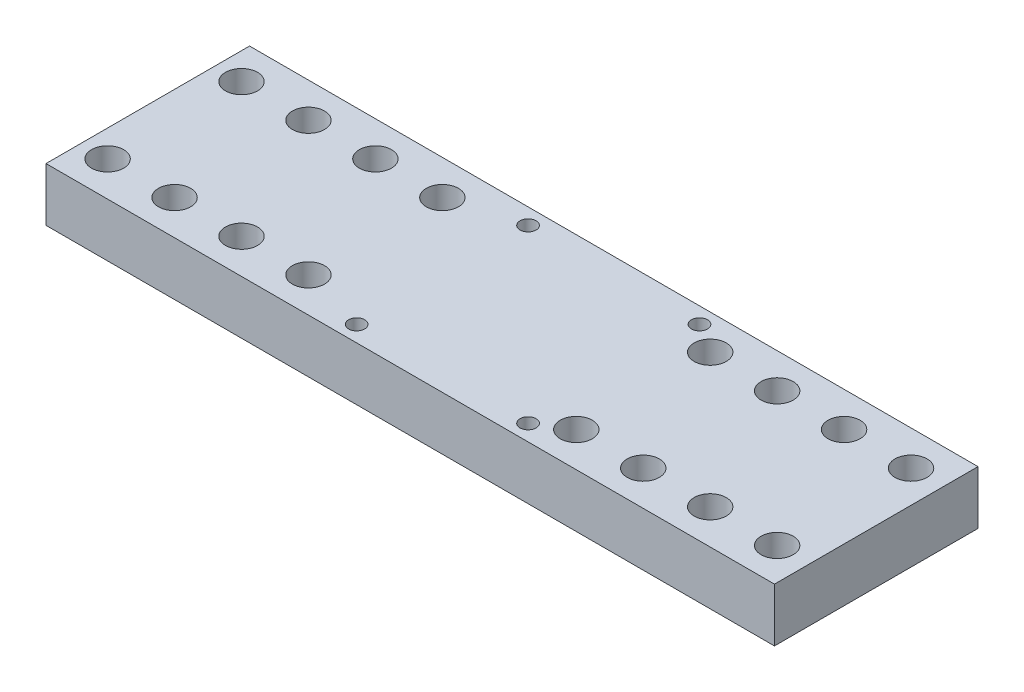
ISO-10303-21;
HEADER;
FILE_DESCRIPTION(('STEP AP214'),'2;1');
FILE_NAME('part.step','',(''),(''),'','','');
FILE_SCHEMA(('AUTOMOTIVE_DESIGN { 1 0 10303 214 1 1 1 1 }'));
ENDSEC;
DATA;
#1=APPLICATION_CONTEXT('core data for automotive mechanical design processes');
#2=APPLICATION_PROTOCOL_DEFINITION('international standard','automotive_design',2000,#1);
#3=PRODUCT_CONTEXT('',#1,'mechanical');
#4=PRODUCT('Part','Part','',(#3));
#5=PRODUCT_RELATED_PRODUCT_CATEGORY('part','',(#4));
#6=PRODUCT_DEFINITION_FORMATION('','',#4);
#7=PRODUCT_DEFINITION_CONTEXT('part definition',#1,'design');
#8=PRODUCT_DEFINITION('design','',#6,#7);
#9=PRODUCT_DEFINITION_SHAPE('','',#8);
#10=(LENGTH_UNIT() NAMED_UNIT(*) SI_UNIT(.MILLI.,.METRE.));
#11=(NAMED_UNIT(*) PLANE_ANGLE_UNIT() SI_UNIT($,.RADIAN.));
#12=(NAMED_UNIT(*) SI_UNIT($,.STERADIAN.) SOLID_ANGLE_UNIT());
#13=UNCERTAINTY_MEASURE_WITH_UNIT(LENGTH_MEASURE(1.E-05),#10,'distance_accuracy_value','');
#14=(GEOMETRIC_REPRESENTATION_CONTEXT(3) GLOBAL_UNCERTAINTY_ASSIGNED_CONTEXT((#13)) GLOBAL_UNIT_ASSIGNED_CONTEXT((#10,
#11,#12)) REPRESENTATION_CONTEXT('',''));
#15=CARTESIAN_POINT('',(0.,0.,0.));
#16=DIRECTION('',(0.,0.,1.));
#17=DIRECTION('',(1.,0.,0.));
#18=AXIS2_PLACEMENT_3D('',#15,#16,#17);
#19=CARTESIAN_POINT('',(0.,10.,0.));
#20=DIRECTION('',(0.,-1.,0.));
#21=DIRECTION('',(0.,0.,-1.));
#22=AXIS2_PLACEMENT_3D('',#19,#20,#21);
#23=PLANE('',#22);
#24=DIRECTION('',(0.,0.,1.));
#25=VECTOR('',#24,1.);
#26=CARTESIAN_POINT('',(-70.9695021838503,10.,35.35946325853));
#27=LINE('',#26,#25);
#28=CARTESIAN_POINT('',(-70.9695021838503,10.,-2.64053674146996));
#29=VERTEX_POINT('',#28);
#30=CARTESIAN_POINT('',(-70.9695021838503,10.,35.35946325853));
#31=VERTEX_POINT('',#30);
#32=EDGE_CURVE('E85',#29,#31,#27,.T.);
#33=ORIENTED_EDGE('',*,*,#32,.T.);
#34=DIRECTION('',(1.,0.,0.));
#35=VECTOR('',#34,1.);
#36=CARTESIAN_POINT('',(-70.9695021838503,10.,35.35946325853));
#37=LINE('',#36,#35);
#38=CARTESIAN_POINT('',(65.0304978161497,10.,35.35946325853));
#39=VERTEX_POINT('',#38);
#40=EDGE_CURVE('E80',#31,#39,#37,.T.);
#41=ORIENTED_EDGE('',*,*,#40,.T.);
#42=DIRECTION('',(0.,0.,-1.));
#43=VECTOR('',#42,1.);
#44=CARTESIAN_POINT('',(65.0304978161497,10.,35.35946325853));
#45=LINE('',#44,#43);
#46=CARTESIAN_POINT('',(65.0304978161497,10.,-2.64053674146996));
#47=VERTEX_POINT('',#46);
#48=EDGE_CURVE('E83',#39,#47,#45,.T.);
#49=ORIENTED_EDGE('',*,*,#48,.T.);
#50=DIRECTION('',(-1.,0.,0.));
#51=VECTOR('',#50,1.);
#52=CARTESIAN_POINT('',(-70.9695021838503,10.,-2.64053674146996));
#53=LINE('',#52,#51);
#54=EDGE_CURVE('E50',#47,#29,#53,.T.);
#55=ORIENTED_EDGE('',*,*,#54,.T.);
#56=EDGE_LOOP('',(#33,#41,#49,#55));
#57=FACE_BOUND('',#56,.T.);
#58=CARTESIAN_POINT('',(-15.9695021838503,10.,0.359463258530042));
#59=DIRECTION('',(0.,1.,0.));
#60=DIRECTION('',(0.,0.,1.));
#61=AXIS2_PLACEMENT_3D('',#58,#59,#60);
#62=CIRCLE('',#61,1.5);
#63=CARTESIAN_POINT('',(-15.9695021838503,10.,1.85946325853004));
#64=VERTEX_POINT('',#63);
#65=EDGE_CURVE('E100',#64,#64,#62,.T.);
#66=ORIENTED_EDGE('',*,*,#65,.F.);
#67=EDGE_LOOP('',(#66));
#68=FACE_BOUND('',#67,.T.);
#69=CARTESIAN_POINT('',(16.0304978161497,10.,0.359463258530042));
#70=DIRECTION('',(0.,1.,0.));
#71=DIRECTION('',(0.,0.,1.));
#72=AXIS2_PLACEMENT_3D('',#69,#70,#71);
#73=CIRCLE('',#72,1.5);
#74=CARTESIAN_POINT('',(16.0304978161497,10.,1.85946325853004));
#75=VERTEX_POINT('',#74);
#76=EDGE_CURVE('E115',#75,#75,#73,.T.);
#77=ORIENTED_EDGE('',*,*,#76,.F.);
#78=EDGE_LOOP('',(#77));
#79=FACE_BOUND('',#78,.T.);
#80=CARTESIAN_POINT('',(16.0304978161497,10.,32.35946325853));
#81=DIRECTION('',(0.,1.,0.));
#82=DIRECTION('',(0.,0.,1.));
#83=AXIS2_PLACEMENT_3D('',#80,#81,#82);
#84=CIRCLE('',#83,1.5);
#85=CARTESIAN_POINT('',(16.0304978161497,10.,33.85946325853));
#86=VERTEX_POINT('',#85);
#87=EDGE_CURVE('E121',#86,#86,#84,.T.);
#88=ORIENTED_EDGE('',*,*,#87,.F.);
#89=EDGE_LOOP('',(#88));
#90=FACE_BOUND('',#89,.T.);
#91=CARTESIAN_POINT('',(-15.9695021838503,10.,32.35946325853));
#92=DIRECTION('',(0.,1.,0.));
#93=DIRECTION('',(0.,0.,1.));
#94=AXIS2_PLACEMENT_3D('',#91,#92,#93);
#95=CIRCLE('',#94,1.5);
#96=CARTESIAN_POINT('',(-15.9695021838503,10.,33.85946325853));
#97=VERTEX_POINT('',#96);
#98=EDGE_CURVE('E127',#97,#97,#95,.T.);
#99=ORIENTED_EDGE('',*,*,#98,.F.);
#100=EDGE_LOOP('',(#99));
#101=FACE_BOUND('',#100,.T.);
#102=CARTESIAN_POINT('',(-65.9695021838503,10.,3.85946325853004));
#103=DIRECTION('',(0.,1.,0.));
#104=DIRECTION('',(0.,0.,1.));
#105=AXIS2_PLACEMENT_3D('',#102,#103,#104);
#106=CIRCLE('',#105,3.00000000000001);
#107=CARTESIAN_POINT('',(-65.9695021838503,10.,6.85946325853005));
#108=VERTEX_POINT('',#107);
#109=EDGE_CURVE('E133',#108,#108,#106,.T.);
#110=ORIENTED_EDGE('',*,*,#109,.F.);
#111=EDGE_LOOP('',(#110));
#112=FACE_BOUND('',#111,.T.);
#113=CARTESIAN_POINT('',(-40.9695021838503,10.,3.85946325853004));
#114=DIRECTION('',(0.,1.,0.));
#115=DIRECTION('',(0.,0.,1.));
#116=AXIS2_PLACEMENT_3D('',#113,#114,#115);
#117=CIRCLE('',#116,3.);
#118=CARTESIAN_POINT('',(-40.9695021838503,10.,6.85946325853004));
#119=VERTEX_POINT('',#118);
#120=EDGE_CURVE('E139',#119,#119,#117,.T.);
#121=ORIENTED_EDGE('',*,*,#120,.F.);
#122=EDGE_LOOP('',(#121));
#123=FACE_BOUND('',#122,.T.);
#124=CARTESIAN_POINT('',(-40.9695021838503,10.,28.85946325853));
#125=DIRECTION('',(0.,1.,0.));
#126=DIRECTION('',(0.,0.,1.));
#127=AXIS2_PLACEMENT_3D('',#124,#125,#126);
#128=CIRCLE('',#127,3.);
#129=CARTESIAN_POINT('',(-40.9695021838503,10.,31.85946325853));
#130=VERTEX_POINT('',#129);
#131=EDGE_CURVE('E145',#130,#130,#128,.T.);
#132=ORIENTED_EDGE('',*,*,#131,.F.);
#133=EDGE_LOOP('',(#132));
#134=FACE_BOUND('',#133,.T.);
#135=CARTESIAN_POINT('',(-65.9695021838503,10.,28.85946325853));
#136=DIRECTION('',(0.,1.,0.));
#137=DIRECTION('',(0.,0.,1.));
#138=AXIS2_PLACEMENT_3D('',#135,#136,#137);
#139=CIRCLE('',#138,3.00000000000001);
#140=CARTESIAN_POINT('',(-65.9695021838503,10.,31.85946325853));
#141=VERTEX_POINT('',#140);
#142=EDGE_CURVE('E151',#141,#141,#139,.T.);
#143=ORIENTED_EDGE('',*,*,#142,.F.);
#144=EDGE_LOOP('',(#143));
#145=FACE_BOUND('',#144,.T.);
#146=CARTESIAN_POINT('',(-53.4695021838503,10.,3.85946325853004));
#147=DIRECTION('',(0.,1.,0.));
#148=DIRECTION('',(0.,0.,1.));
#149=AXIS2_PLACEMENT_3D('',#146,#147,#148);
#150=CIRCLE('',#149,3.00000000000001);
#151=CARTESIAN_POINT('',(-53.4695021838503,10.,6.85946325853005));
#152=VERTEX_POINT('',#151);
#153=EDGE_CURVE('E157',#152,#152,#150,.T.);
#154=ORIENTED_EDGE('',*,*,#153,.F.);
#155=EDGE_LOOP('',(#154));
#156=FACE_BOUND('',#155,.T.);
#157=CARTESIAN_POINT('',(-28.4695021838503,10.,3.85946325853004));
#158=DIRECTION('',(0.,1.,0.));
#159=DIRECTION('',(0.,0.,1.));
#160=AXIS2_PLACEMENT_3D('',#157,#158,#159);
#161=CIRCLE('',#160,3.);
#162=CARTESIAN_POINT('',(-28.4695021838503,10.,6.85946325853004));
#163=VERTEX_POINT('',#162);
#164=EDGE_CURVE('E163',#163,#163,#161,.T.);
#165=ORIENTED_EDGE('',*,*,#164,.F.);
#166=EDGE_LOOP('',(#165));
#167=FACE_BOUND('',#166,.T.);
#168=CARTESIAN_POINT('',(-28.4695021838503,10.,28.85946325853));
#169=DIRECTION('',(0.,1.,0.));
#170=DIRECTION('',(0.,0.,1.));
#171=AXIS2_PLACEMENT_3D('',#168,#169,#170);
#172=CIRCLE('',#171,3.);
#173=CARTESIAN_POINT('',(-28.4695021838503,10.,31.85946325853));
#174=VERTEX_POINT('',#173);
#175=EDGE_CURVE('E169',#174,#174,#172,.T.);
#176=ORIENTED_EDGE('',*,*,#175,.F.);
#177=EDGE_LOOP('',(#176));
#178=FACE_BOUND('',#177,.T.);
#179=CARTESIAN_POINT('',(-53.4695021838503,10.,28.85946325853));
#180=DIRECTION('',(0.,1.,0.));
#181=DIRECTION('',(0.,0.,1.));
#182=AXIS2_PLACEMENT_3D('',#179,#180,#181);
#183=CIRCLE('',#182,3.00000000000001);
#184=CARTESIAN_POINT('',(-53.4695021838503,10.,31.85946325853));
#185=VERTEX_POINT('',#184);
#186=EDGE_CURVE('E175',#185,#185,#183,.T.);
#187=ORIENTED_EDGE('',*,*,#186,.F.);
#188=EDGE_LOOP('',(#187));
#189=FACE_BOUND('',#188,.T.);
#190=CARTESIAN_POINT('',(34.0304978161497,10.,3.85946325853004));
#191=DIRECTION('',(0.,1.,0.));
#192=DIRECTION('',(0.,0.,1.));
#193=AXIS2_PLACEMENT_3D('',#190,#191,#192);
#194=CIRCLE('',#193,3.00000000000001);
#195=CARTESIAN_POINT('',(34.0304978161497,10.,6.85946325853005));
#196=VERTEX_POINT('',#195);
#197=EDGE_CURVE('E181',#196,#196,#194,.T.);
#198=ORIENTED_EDGE('',*,*,#197,.F.);
#199=EDGE_LOOP('',(#198));
#200=FACE_BOUND('',#199,.T.);
#201=CARTESIAN_POINT('',(59.0304978161497,10.,3.85946325853004));
#202=DIRECTION('',(0.,1.,0.));
#203=DIRECTION('',(0.,0.,1.));
#204=AXIS2_PLACEMENT_3D('',#201,#202,#203);
#205=CIRCLE('',#204,3.);
#206=CARTESIAN_POINT('',(59.0304978161497,10.,6.85946325853004));
#207=VERTEX_POINT('',#206);
#208=EDGE_CURVE('E187',#207,#207,#205,.T.);
#209=ORIENTED_EDGE('',*,*,#208,.F.);
#210=EDGE_LOOP('',(#209));
#211=FACE_BOUND('',#210,.T.);
#212=CARTESIAN_POINT('',(59.0304978161497,10.,28.85946325853));
#213=DIRECTION('',(0.,1.,0.));
#214=DIRECTION('',(0.,0.,1.));
#215=AXIS2_PLACEMENT_3D('',#212,#213,#214);
#216=CIRCLE('',#215,3.);
#217=CARTESIAN_POINT('',(59.0304978161497,10.,31.85946325853));
#218=VERTEX_POINT('',#217);
#219=EDGE_CURVE('E193',#218,#218,#216,.T.);
#220=ORIENTED_EDGE('',*,*,#219,.F.);
#221=EDGE_LOOP('',(#220));
#222=FACE_BOUND('',#221,.T.);
#223=CARTESIAN_POINT('',(34.0304978161497,10.,28.85946325853));
#224=DIRECTION('',(0.,1.,0.));
#225=DIRECTION('',(0.,0.,1.));
#226=AXIS2_PLACEMENT_3D('',#223,#224,#225);
#227=CIRCLE('',#226,3.00000000000001);
#228=CARTESIAN_POINT('',(34.0304978161497,10.,31.85946325853));
#229=VERTEX_POINT('',#228);
#230=EDGE_CURVE('E199',#229,#229,#227,.T.);
#231=ORIENTED_EDGE('',*,*,#230,.F.);
#232=EDGE_LOOP('',(#231));
#233=FACE_BOUND('',#232,.T.);
#234=CARTESIAN_POINT('',(21.5304978161497,10.,3.85946325853004));
#235=DIRECTION('',(0.,1.,0.));
#236=DIRECTION('',(0.,0.,1.));
#237=AXIS2_PLACEMENT_3D('',#234,#235,#236);
#238=CIRCLE('',#237,3.00000000000001);
#239=CARTESIAN_POINT('',(21.5304978161497,10.,6.85946325853005));
#240=VERTEX_POINT('',#239);
#241=EDGE_CURVE('E205',#240,#240,#238,.T.);
#242=ORIENTED_EDGE('',*,*,#241,.F.);
#243=EDGE_LOOP('',(#242));
#244=FACE_BOUND('',#243,.T.);
#245=CARTESIAN_POINT('',(46.5304978161497,10.,3.85946325853004));
#246=DIRECTION('',(0.,1.,0.));
#247=DIRECTION('',(0.,0.,1.));
#248=AXIS2_PLACEMENT_3D('',#245,#246,#247);
#249=CIRCLE('',#248,3.);
#250=CARTESIAN_POINT('',(46.5304978161497,10.,6.85946325853004));
#251=VERTEX_POINT('',#250);
#252=EDGE_CURVE('E211',#251,#251,#249,.T.);
#253=ORIENTED_EDGE('',*,*,#252,.F.);
#254=EDGE_LOOP('',(#253));
#255=FACE_BOUND('',#254,.T.);
#256=CARTESIAN_POINT('',(46.5304978161497,10.,28.85946325853));
#257=DIRECTION('',(0.,1.,0.));
#258=DIRECTION('',(0.,0.,1.));
#259=AXIS2_PLACEMENT_3D('',#256,#257,#258);
#260=CIRCLE('',#259,3.);
#261=CARTESIAN_POINT('',(46.5304978161497,10.,31.85946325853));
#262=VERTEX_POINT('',#261);
#263=EDGE_CURVE('E217',#262,#262,#260,.T.);
#264=ORIENTED_EDGE('',*,*,#263,.F.);
#265=EDGE_LOOP('',(#264));
#266=FACE_BOUND('',#265,.T.);
#267=CARTESIAN_POINT('',(21.5304978161497,10.,28.85946325853));
#268=DIRECTION('',(0.,1.,0.));
#269=DIRECTION('',(0.,0.,1.));
#270=AXIS2_PLACEMENT_3D('',#267,#268,#269);
#271=CIRCLE('',#270,3.00000000000001);
#272=CARTESIAN_POINT('',(21.5304978161497,10.,31.85946325853));
#273=VERTEX_POINT('',#272);
#274=EDGE_CURVE('E223',#273,#273,#271,.T.);
#275=ORIENTED_EDGE('',*,*,#274,.F.);
#276=EDGE_LOOP('',(#275));
#277=FACE_BOUND('',#276,.T.);
#278=ADVANCED_FACE('F33',(#57,#68,#79,#90,#101,#112,#123,#134,#145,#156,#167,#178,#189,#200,
#211,#222,#233,#244,#255,#266,#277),#23,.F.);
#279=CARTESIAN_POINT('',(0.,0.,0.));
#280=DIRECTION('',(0.,-1.,0.));
#281=DIRECTION('',(0.,0.,-1.));
#282=AXIS2_PLACEMENT_3D('',#279,#280,#281);
#283=PLANE('',#282);
#284=CARTESIAN_POINT('',(46.5304978161497,0.,28.85946325853));
#285=DIRECTION('',(0.,1.,0.));
#286=DIRECTION('',(0.,0.,1.));
#287=AXIS2_PLACEMENT_3D('',#284,#285,#286);
#288=CIRCLE('',#287,3.);
#289=CARTESIAN_POINT('',(46.5304978161497,0.,31.85946325853));
#290=VERTEX_POINT('',#289);
#291=EDGE_CURVE('E220',#290,#290,#288,.T.);
#292=ORIENTED_EDGE('',*,*,#291,.T.);
#293=EDGE_LOOP('',(#292));
#294=FACE_BOUND('',#293,.T.);
#295=CARTESIAN_POINT('',(21.5304978161497,0.,3.85946325853004));
#296=DIRECTION('',(0.,1.,0.));
#297=DIRECTION('',(0.,0.,1.));
#298=AXIS2_PLACEMENT_3D('',#295,#296,#297);
#299=CIRCLE('',#298,3.00000000000001);
#300=CARTESIAN_POINT('',(21.5304978161497,0.,6.85946325853005));
#301=VERTEX_POINT('',#300);
#302=EDGE_CURVE('E208',#301,#301,#299,.T.);
#303=ORIENTED_EDGE('',*,*,#302,.T.);
#304=EDGE_LOOP('',(#303));
#305=FACE_BOUND('',#304,.T.);
#306=CARTESIAN_POINT('',(59.0304978161497,0.,28.85946325853));
#307=DIRECTION('',(0.,1.,0.));
#308=DIRECTION('',(0.,0.,1.));
#309=AXIS2_PLACEMENT_3D('',#306,#307,#308);
#310=CIRCLE('',#309,3.);
#311=CARTESIAN_POINT('',(59.0304978161497,0.,31.85946325853));
#312=VERTEX_POINT('',#311);
#313=EDGE_CURVE('E196',#312,#312,#310,.T.);
#314=ORIENTED_EDGE('',*,*,#313,.T.);
#315=EDGE_LOOP('',(#314));
#316=FACE_BOUND('',#315,.T.);
#317=CARTESIAN_POINT('',(34.0304978161497,0.,3.85946325853004));
#318=DIRECTION('',(0.,1.,0.));
#319=DIRECTION('',(0.,0.,1.));
#320=AXIS2_PLACEMENT_3D('',#317,#318,#319);
#321=CIRCLE('',#320,3.00000000000001);
#322=CARTESIAN_POINT('',(34.0304978161497,0.,6.85946325853005));
#323=VERTEX_POINT('',#322);
#324=EDGE_CURVE('E184',#323,#323,#321,.T.);
#325=ORIENTED_EDGE('',*,*,#324,.T.);
#326=EDGE_LOOP('',(#325));
#327=FACE_BOUND('',#326,.T.);
#328=CARTESIAN_POINT('',(-28.4695021838503,0.,28.85946325853));
#329=DIRECTION('',(0.,1.,0.));
#330=DIRECTION('',(0.,0.,1.));
#331=AXIS2_PLACEMENT_3D('',#328,#329,#330);
#332=CIRCLE('',#331,3.);
#333=CARTESIAN_POINT('',(-28.4695021838503,0.,31.85946325853));
#334=VERTEX_POINT('',#333);
#335=EDGE_CURVE('E172',#334,#334,#332,.T.);
#336=ORIENTED_EDGE('',*,*,#335,.T.);
#337=EDGE_LOOP('',(#336));
#338=FACE_BOUND('',#337,.T.);
#339=CARTESIAN_POINT('',(-53.4695021838503,0.,3.85946325853004));
#340=DIRECTION('',(0.,1.,0.));
#341=DIRECTION('',(0.,0.,1.));
#342=AXIS2_PLACEMENT_3D('',#339,#340,#341);
#343=CIRCLE('',#342,3.00000000000001);
#344=CARTESIAN_POINT('',(-53.4695021838503,0.,6.85946325853005));
#345=VERTEX_POINT('',#344);
#346=EDGE_CURVE('E160',#345,#345,#343,.T.);
#347=ORIENTED_EDGE('',*,*,#346,.T.);
#348=EDGE_LOOP('',(#347));
#349=FACE_BOUND('',#348,.T.);
#350=CARTESIAN_POINT('',(-40.9695021838503,0.,28.85946325853));
#351=DIRECTION('',(0.,1.,0.));
#352=DIRECTION('',(0.,0.,1.));
#353=AXIS2_PLACEMENT_3D('',#350,#351,#352);
#354=CIRCLE('',#353,3.);
#355=CARTESIAN_POINT('',(-40.9695021838503,0.,31.85946325853));
#356=VERTEX_POINT('',#355);
#357=EDGE_CURVE('E148',#356,#356,#354,.T.);
#358=ORIENTED_EDGE('',*,*,#357,.T.);
#359=EDGE_LOOP('',(#358));
#360=FACE_BOUND('',#359,.T.);
#361=CARTESIAN_POINT('',(-65.9695021838503,0.,3.85946325853004));
#362=DIRECTION('',(0.,1.,0.));
#363=DIRECTION('',(0.,0.,1.));
#364=AXIS2_PLACEMENT_3D('',#361,#362,#363);
#365=CIRCLE('',#364,3.00000000000001);
#366=CARTESIAN_POINT('',(-65.9695021838503,0.,6.85946325853005));
#367=VERTEX_POINT('',#366);
#368=EDGE_CURVE('E136',#367,#367,#365,.T.);
#369=ORIENTED_EDGE('',*,*,#368,.T.);
#370=EDGE_LOOP('',(#369));
#371=FACE_BOUND('',#370,.T.);
#372=CARTESIAN_POINT('',(16.0304978161497,0.,32.35946325853));
#373=DIRECTION('',(0.,1.,0.));
#374=DIRECTION('',(0.,0.,1.));
#375=AXIS2_PLACEMENT_3D('',#372,#373,#374);
#376=CIRCLE('',#375,1.5);
#377=CARTESIAN_POINT('',(16.0304978161497,0.,33.85946325853));
#378=VERTEX_POINT('',#377);
#379=EDGE_CURVE('E124',#378,#378,#376,.T.);
#380=ORIENTED_EDGE('',*,*,#379,.T.);
#381=EDGE_LOOP('',(#380));
#382=FACE_BOUND('',#381,.T.);
#383=CARTESIAN_POINT('',(-15.9695021838503,0.,0.359463258530042));
#384=DIRECTION('',(0.,1.,0.));
#385=DIRECTION('',(0.,0.,1.));
#386=AXIS2_PLACEMENT_3D('',#383,#384,#385);
#387=CIRCLE('',#386,1.5);
#388=CARTESIAN_POINT('',(-15.9695021838503,0.,1.85946325853004));
#389=VERTEX_POINT('',#388);
#390=EDGE_CURVE('E112',#389,#389,#387,.T.);
#391=ORIENTED_EDGE('',*,*,#390,.T.);
#392=EDGE_LOOP('',(#391));
#393=FACE_BOUND('',#392,.T.);
#394=DIRECTION('',(0.,0.,1.));
#395=VECTOR('',#394,1.);
#396=CARTESIAN_POINT('',(-70.9695021838503,0.,35.35946325853));
#397=LINE('',#396,#395);
#398=CARTESIAN_POINT('',(-70.9695021838503,0.,-2.64053674146996));
#399=VERTEX_POINT('',#398);
#400=CARTESIAN_POINT('',(-70.9695021838503,0.,35.35946325853));
#401=VERTEX_POINT('',#400);
#402=EDGE_CURVE('E97',#399,#401,#397,.T.);
#403=ORIENTED_EDGE('',*,*,#402,.F.);
#404=DIRECTION('',(-1.,0.,0.));
#405=VECTOR('',#404,1.);
#406=CARTESIAN_POINT('',(-70.9695021838503,0.,-2.64053674146996));
#407=LINE('',#406,#405);
#408=CARTESIAN_POINT('',(65.0304978161497,0.,-2.64053674146996));
#409=VERTEX_POINT('',#408);
#410=EDGE_CURVE('E73',#409,#399,#407,.T.);
#411=ORIENTED_EDGE('',*,*,#410,.F.);
#412=DIRECTION('',(0.,0.,-1.));
#413=VECTOR('',#412,1.);
#414=CARTESIAN_POINT('',(65.0304978161497,0.,35.35946325853));
#415=LINE('',#414,#413);
#416=CARTESIAN_POINT('',(65.0304978161497,0.,35.35946325853));
#417=VERTEX_POINT('',#416);
#418=EDGE_CURVE('E67',#417,#409,#415,.T.);
#419=ORIENTED_EDGE('',*,*,#418,.F.);
#420=DIRECTION('',(1.,0.,0.));
#421=VECTOR('',#420,1.);
#422=CARTESIAN_POINT('',(-70.9695021838503,0.,35.35946325853));
#423=LINE('',#422,#421);
#424=EDGE_CURVE('E89',#401,#417,#423,.T.);
#425=ORIENTED_EDGE('',*,*,#424,.F.);
#426=EDGE_LOOP('',(#403,#411,#419,#425));
#427=FACE_BOUND('',#426,.T.);
#428=CARTESIAN_POINT('',(16.0304978161497,0.,0.359463258530042));
#429=DIRECTION('',(0.,1.,0.));
#430=DIRECTION('',(0.,0.,1.));
#431=AXIS2_PLACEMENT_3D('',#428,#429,#430);
#432=CIRCLE('',#431,1.5);
#433=CARTESIAN_POINT('',(16.0304978161497,0.,1.85946325853004));
#434=VERTEX_POINT('',#433);
#435=EDGE_CURVE('E118',#434,#434,#432,.T.);
#436=ORIENTED_EDGE('',*,*,#435,.T.);
#437=EDGE_LOOP('',(#436));
#438=FACE_BOUND('',#437,.T.);
#439=CARTESIAN_POINT('',(-15.9695021838503,0.,32.35946325853));
#440=DIRECTION('',(0.,1.,0.));
#441=DIRECTION('',(0.,0.,1.));
#442=AXIS2_PLACEMENT_3D('',#439,#440,#441);
#443=CIRCLE('',#442,1.5);
#444=CARTESIAN_POINT('',(-15.9695021838503,0.,33.85946325853));
#445=VERTEX_POINT('',#444);
#446=EDGE_CURVE('E130',#445,#445,#443,.T.);
#447=ORIENTED_EDGE('',*,*,#446,.T.);
#448=EDGE_LOOP('',(#447));
#449=FACE_BOUND('',#448,.T.);
#450=CARTESIAN_POINT('',(-40.9695021838503,0.,3.85946325853004));
#451=DIRECTION('',(0.,1.,0.));
#452=DIRECTION('',(0.,0.,1.));
#453=AXIS2_PLACEMENT_3D('',#450,#451,#452);
#454=CIRCLE('',#453,3.);
#455=CARTESIAN_POINT('',(-40.9695021838503,0.,6.85946325853004));
#456=VERTEX_POINT('',#455);
#457=EDGE_CURVE('E142',#456,#456,#454,.T.);
#458=ORIENTED_EDGE('',*,*,#457,.T.);
#459=EDGE_LOOP('',(#458));
#460=FACE_BOUND('',#459,.T.);
#461=CARTESIAN_POINT('',(-65.9695021838503,0.,28.85946325853));
#462=DIRECTION('',(0.,1.,0.));
#463=DIRECTION('',(0.,0.,1.));
#464=AXIS2_PLACEMENT_3D('',#461,#462,#463);
#465=CIRCLE('',#464,3.00000000000001);
#466=CARTESIAN_POINT('',(-65.9695021838503,0.,31.85946325853));
#467=VERTEX_POINT('',#466);
#468=EDGE_CURVE('E154',#467,#467,#465,.T.);
#469=ORIENTED_EDGE('',*,*,#468,.T.);
#470=EDGE_LOOP('',(#469));
#471=FACE_BOUND('',#470,.T.);
#472=CARTESIAN_POINT('',(-28.4695021838503,0.,3.85946325853004));
#473=DIRECTION('',(0.,1.,0.));
#474=DIRECTION('',(0.,0.,1.));
#475=AXIS2_PLACEMENT_3D('',#472,#473,#474);
#476=CIRCLE('',#475,3.);
#477=CARTESIAN_POINT('',(-28.4695021838503,0.,6.85946325853004));
#478=VERTEX_POINT('',#477);
#479=EDGE_CURVE('E166',#478,#478,#476,.T.);
#480=ORIENTED_EDGE('',*,*,#479,.T.);
#481=EDGE_LOOP('',(#480));
#482=FACE_BOUND('',#481,.T.);
#483=CARTESIAN_POINT('',(-53.4695021838503,0.,28.85946325853));
#484=DIRECTION('',(0.,1.,0.));
#485=DIRECTION('',(0.,0.,1.));
#486=AXIS2_PLACEMENT_3D('',#483,#484,#485);
#487=CIRCLE('',#486,3.00000000000001);
#488=CARTESIAN_POINT('',(-53.4695021838503,0.,31.85946325853));
#489=VERTEX_POINT('',#488);
#490=EDGE_CURVE('E178',#489,#489,#487,.T.);
#491=ORIENTED_EDGE('',*,*,#490,.T.);
#492=EDGE_LOOP('',(#491));
#493=FACE_BOUND('',#492,.T.);
#494=CARTESIAN_POINT('',(59.0304978161497,0.,3.85946325853004));
#495=DIRECTION('',(0.,1.,0.));
#496=DIRECTION('',(0.,0.,1.));
#497=AXIS2_PLACEMENT_3D('',#494,#495,#496);
#498=CIRCLE('',#497,3.);
#499=CARTESIAN_POINT('',(59.0304978161497,0.,6.85946325853004));
#500=VERTEX_POINT('',#499);
#501=EDGE_CURVE('E190',#500,#500,#498,.T.);
#502=ORIENTED_EDGE('',*,*,#501,.T.);
#503=EDGE_LOOP('',(#502));
#504=FACE_BOUND('',#503,.T.);
#505=CARTESIAN_POINT('',(34.0304978161497,0.,28.85946325853));
#506=DIRECTION('',(0.,1.,0.));
#507=DIRECTION('',(0.,0.,1.));
#508=AXIS2_PLACEMENT_3D('',#505,#506,#507);
#509=CIRCLE('',#508,3.00000000000001);
#510=CARTESIAN_POINT('',(34.0304978161497,0.,31.85946325853));
#511=VERTEX_POINT('',#510);
#512=EDGE_CURVE('E202',#511,#511,#509,.T.);
#513=ORIENTED_EDGE('',*,*,#512,.T.);
#514=EDGE_LOOP('',(#513));
#515=FACE_BOUND('',#514,.T.);
#516=CARTESIAN_POINT('',(46.5304978161497,0.,3.85946325853004));
#517=DIRECTION('',(0.,1.,0.));
#518=DIRECTION('',(0.,0.,1.));
#519=AXIS2_PLACEMENT_3D('',#516,#517,#518);
#520=CIRCLE('',#519,3.);
#521=CARTESIAN_POINT('',(46.5304978161497,0.,6.85946325853004));
#522=VERTEX_POINT('',#521);
#523=EDGE_CURVE('E214',#522,#522,#520,.T.);
#524=ORIENTED_EDGE('',*,*,#523,.T.);
#525=EDGE_LOOP('',(#524));
#526=FACE_BOUND('',#525,.T.);
#527=CARTESIAN_POINT('',(21.5304978161497,0.,28.85946325853));
#528=DIRECTION('',(0.,1.,0.));
#529=DIRECTION('',(0.,0.,1.));
#530=AXIS2_PLACEMENT_3D('',#527,#528,#529);
#531=CIRCLE('',#530,3.00000000000001);
#532=CARTESIAN_POINT('',(21.5304978161497,0.,31.85946325853));
#533=VERTEX_POINT('',#532);
#534=EDGE_CURVE('E226',#533,#533,#531,.T.);
#535=ORIENTED_EDGE('',*,*,#534,.T.);
#536=EDGE_LOOP('',(#535));
#537=FACE_BOUND('',#536,.T.);
#538=ADVANCED_FACE('F108',(#294,#305,#316,#327,#338,#349,#360,#371,#382,#393,#427,#438,#449,
#460,#471,#482,#493,#504,#515,#526,#537),#283,.T.);
#539=CARTESIAN_POINT('',(-70.9695021838503,10.,35.35946325853));
#540=DIRECTION('',(1.,0.,0.));
#541=DIRECTION('',(0.,0.,-1.));
#542=AXIS2_PLACEMENT_3D('',#539,#540,#541);
#543=PLANE('',#542);
#544=ORIENTED_EDGE('',*,*,#402,.T.);
#545=DIRECTION('',(0.,-1.,0.));
#546=VECTOR('',#545,1.);
#547=CARTESIAN_POINT('',(-70.9695021838503,10.,35.35946325853));
#548=LINE('',#547,#546);
#549=EDGE_CURVE('E11',#31,#401,#548,.T.);
#550=ORIENTED_EDGE('',*,*,#549,.F.);
#551=ORIENTED_EDGE('',*,*,#32,.F.);
#552=DIRECTION('',(0.,-1.,0.));
#553=VECTOR('',#552,1.);
#554=CARTESIAN_POINT('',(-70.9695021838503,10.,-2.64053674146996));
#555=LINE('',#554,#553);
#556=EDGE_CURVE('E93',#29,#399,#555,.T.);
#557=ORIENTED_EDGE('',*,*,#556,.T.);
#558=EDGE_LOOP('',(#544,#550,#551,#557));
#559=FACE_BOUND('',#558,.T.);
#560=ADVANCED_FACE('F35',(#559),#543,.F.);
#561=CARTESIAN_POINT('',(-70.9695021838503,10.,35.35946325853));
#562=DIRECTION('',(0.,0.,-1.));
#563=DIRECTION('',(-1.,0.,0.));
#564=AXIS2_PLACEMENT_3D('',#561,#562,#563);
#565=PLANE('',#564);
#566=ORIENTED_EDGE('',*,*,#424,.T.);
#567=DIRECTION('',(0.,-1.,0.));
#568=VECTOR('',#567,1.);
#569=CARTESIAN_POINT('',(65.0304978161497,10.,35.35946325853));
#570=LINE('',#569,#568);
#571=EDGE_CURVE('E42',#39,#417,#570,.T.);
#572=ORIENTED_EDGE('',*,*,#571,.F.);
#573=ORIENTED_EDGE('',*,*,#40,.F.);
#574=ORIENTED_EDGE('',*,*,#549,.T.);
#575=EDGE_LOOP('',(#566,#572,#573,#574));
#576=FACE_BOUND('',#575,.T.);
#577=ADVANCED_FACE('F88',(#576),#565,.F.);
#578=CARTESIAN_POINT('',(65.0304978161497,10.,35.35946325853));
#579=DIRECTION('',(-1.,0.,0.));
#580=DIRECTION('',(0.,0.,1.));
#581=AXIS2_PLACEMENT_3D('',#578,#579,#580);
#582=PLANE('',#581);
#583=ORIENTED_EDGE('',*,*,#418,.T.);
#584=DIRECTION('',(0.,-1.,0.));
#585=VECTOR('',#584,1.);
#586=CARTESIAN_POINT('',(65.0304978161497,10.,-2.64053674146996));
#587=LINE('',#586,#585);
#588=EDGE_CURVE('E90',#47,#409,#587,.T.);
#589=ORIENTED_EDGE('',*,*,#588,.F.);
#590=ORIENTED_EDGE('',*,*,#48,.F.);
#591=ORIENTED_EDGE('',*,*,#571,.T.);
#592=EDGE_LOOP('',(#583,#589,#590,#591));
#593=FACE_BOUND('',#592,.T.);
#594=ADVANCED_FACE('F91',(#593),#582,.F.);
#595=CARTESIAN_POINT('',(-70.9695021838503,10.,-2.64053674146996));
#596=DIRECTION('',(0.,0.,1.));
#597=DIRECTION('',(1.,0.,0.));
#598=AXIS2_PLACEMENT_3D('',#595,#596,#597);
#599=PLANE('',#598);
#600=ORIENTED_EDGE('',*,*,#410,.T.);
#601=ORIENTED_EDGE('',*,*,#556,.F.);
#602=ORIENTED_EDGE('',*,*,#54,.F.);
#603=ORIENTED_EDGE('',*,*,#588,.T.);
#604=EDGE_LOOP('',(#600,#601,#602,#603));
#605=FACE_BOUND('',#604,.T.);
#606=ADVANCED_FACE('F105',(#605),#599,.F.);
#607=CARTESIAN_POINT('',(-15.9695021838503,10.,0.359463258530042));
#608=DIRECTION('',(0.,-1.,0.));
#609=DIRECTION('',(0.,0.,-1.));
#610=AXIS2_PLACEMENT_3D('',#607,#608,#609);
#611=CYLINDRICAL_SURFACE('',#610,1.5);
#612=ORIENTED_EDGE('',*,*,#65,.T.);
#613=EDGE_LOOP('',(#612));
#614=FACE_BOUND('',#613,.T.);
#615=ORIENTED_EDGE('',*,*,#390,.F.);
#616=EDGE_LOOP('',(#615));
#617=FACE_BOUND('',#616,.T.);
#618=ADVANCED_FACE('F243',(#614,#617),#611,.F.);
#619=CARTESIAN_POINT('',(16.0304978161497,10.,0.359463258530042));
#620=DIRECTION('',(0.,-1.,0.));
#621=DIRECTION('',(0.,0.,-1.));
#622=AXIS2_PLACEMENT_3D('',#619,#620,#621);
#623=CYLINDRICAL_SURFACE('',#622,1.5);
#624=ORIENTED_EDGE('',*,*,#76,.T.);
#625=EDGE_LOOP('',(#624));
#626=FACE_BOUND('',#625,.T.);
#627=ORIENTED_EDGE('',*,*,#435,.F.);
#628=EDGE_LOOP('',(#627));
#629=FACE_BOUND('',#628,.T.);
#630=ADVANCED_FACE('F289',(#626,#629),#623,.F.);
#631=CARTESIAN_POINT('',(16.0304978161497,10.,32.35946325853));
#632=DIRECTION('',(0.,-1.,0.));
#633=DIRECTION('',(0.,0.,-1.));
#634=AXIS2_PLACEMENT_3D('',#631,#632,#633);
#635=CYLINDRICAL_SURFACE('',#634,1.5);
#636=ORIENTED_EDGE('',*,*,#87,.T.);
#637=EDGE_LOOP('',(#636));
#638=FACE_BOUND('',#637,.T.);
#639=ORIENTED_EDGE('',*,*,#379,.F.);
#640=EDGE_LOOP('',(#639));
#641=FACE_BOUND('',#640,.T.);
#642=ADVANCED_FACE('F297',(#638,#641),#635,.F.);
#643=CARTESIAN_POINT('',(-15.9695021838503,10.,32.35946325853));
#644=DIRECTION('',(0.,-1.,0.));
#645=DIRECTION('',(0.,0.,-1.));
#646=AXIS2_PLACEMENT_3D('',#643,#644,#645);
#647=CYLINDRICAL_SURFACE('',#646,1.5);
#648=ORIENTED_EDGE('',*,*,#98,.T.);
#649=EDGE_LOOP('',(#648));
#650=FACE_BOUND('',#649,.T.);
#651=ORIENTED_EDGE('',*,*,#446,.F.);
#652=EDGE_LOOP('',(#651));
#653=FACE_BOUND('',#652,.T.);
#654=ADVANCED_FACE('F305',(#650,#653),#647,.F.);
#655=CARTESIAN_POINT('',(-65.9695021838503,10.,3.85946325853004));
#656=DIRECTION('',(0.,-1.,0.));
#657=DIRECTION('',(0.,0.,-1.));
#658=AXIS2_PLACEMENT_3D('',#655,#656,#657);
#659=CYLINDRICAL_SURFACE('',#658,3.00000000000001);
#660=ORIENTED_EDGE('',*,*,#109,.T.);
#661=EDGE_LOOP('',(#660));
#662=FACE_BOUND('',#661,.T.);
#663=ORIENTED_EDGE('',*,*,#368,.F.);
#664=EDGE_LOOP('',(#663));
#665=FACE_BOUND('',#664,.T.);
#666=ADVANCED_FACE('F314',(#662,#665),#659,.F.);
#667=CARTESIAN_POINT('',(-40.9695021838503,10.,3.85946325853004));
#668=DIRECTION('',(0.,-1.,0.));
#669=DIRECTION('',(0.,0.,-1.));
#670=AXIS2_PLACEMENT_3D('',#667,#668,#669);
#671=CYLINDRICAL_SURFACE('',#670,3.);
#672=ORIENTED_EDGE('',*,*,#120,.T.);
#673=EDGE_LOOP('',(#672));
#674=FACE_BOUND('',#673,.T.);
#675=ORIENTED_EDGE('',*,*,#457,.F.);
#676=EDGE_LOOP('',(#675));
#677=FACE_BOUND('',#676,.T.);
#678=ADVANCED_FACE('F323',(#674,#677),#671,.F.);
#679=CARTESIAN_POINT('',(-40.9695021838503,10.,28.85946325853));
#680=DIRECTION('',(0.,-1.,0.));
#681=DIRECTION('',(0.,0.,-1.));
#682=AXIS2_PLACEMENT_3D('',#679,#680,#681);
#683=CYLINDRICAL_SURFACE('',#682,3.);
#684=ORIENTED_EDGE('',*,*,#131,.T.);
#685=EDGE_LOOP('',(#684));
#686=FACE_BOUND('',#685,.T.);
#687=ORIENTED_EDGE('',*,*,#357,.F.);
#688=EDGE_LOOP('',(#687));
#689=FACE_BOUND('',#688,.T.);
#690=ADVANCED_FACE('F332',(#686,#689),#683,.F.);
#691=CARTESIAN_POINT('',(-65.9695021838503,10.,28.85946325853));
#692=DIRECTION('',(0.,-1.,0.));
#693=DIRECTION('',(0.,0.,-1.));
#694=AXIS2_PLACEMENT_3D('',#691,#692,#693);
#695=CYLINDRICAL_SURFACE('',#694,3.00000000000001);
#696=ORIENTED_EDGE('',*,*,#142,.T.);
#697=EDGE_LOOP('',(#696));
#698=FACE_BOUND('',#697,.T.);
#699=ORIENTED_EDGE('',*,*,#468,.F.);
#700=EDGE_LOOP('',(#699));
#701=FACE_BOUND('',#700,.T.);
#702=ADVANCED_FACE('F341',(#698,#701),#695,.F.);
#703=CARTESIAN_POINT('',(-53.4695021838503,10.,3.85946325853004));
#704=DIRECTION('',(0.,-1.,0.));
#705=DIRECTION('',(0.,0.,-1.));
#706=AXIS2_PLACEMENT_3D('',#703,#704,#705);
#707=CYLINDRICAL_SURFACE('',#706,3.00000000000001);
#708=ORIENTED_EDGE('',*,*,#153,.T.);
#709=EDGE_LOOP('',(#708));
#710=FACE_BOUND('',#709,.T.);
#711=ORIENTED_EDGE('',*,*,#346,.F.);
#712=EDGE_LOOP('',(#711));
#713=FACE_BOUND('',#712,.T.);
#714=ADVANCED_FACE('F350',(#710,#713),#707,.F.);
#715=CARTESIAN_POINT('',(-28.4695021838503,10.,3.85946325853004));
#716=DIRECTION('',(0.,-1.,0.));
#717=DIRECTION('',(0.,0.,-1.));
#718=AXIS2_PLACEMENT_3D('',#715,#716,#717);
#719=CYLINDRICAL_SURFACE('',#718,3.);
#720=ORIENTED_EDGE('',*,*,#164,.T.);
#721=EDGE_LOOP('',(#720));
#722=FACE_BOUND('',#721,.T.);
#723=ORIENTED_EDGE('',*,*,#479,.F.);
#724=EDGE_LOOP('',(#723));
#725=FACE_BOUND('',#724,.T.);
#726=ADVANCED_FACE('F359',(#722,#725),#719,.F.);
#727=CARTESIAN_POINT('',(-28.4695021838503,10.,28.85946325853));
#728=DIRECTION('',(0.,-1.,0.));
#729=DIRECTION('',(0.,0.,-1.));
#730=AXIS2_PLACEMENT_3D('',#727,#728,#729);
#731=CYLINDRICAL_SURFACE('',#730,3.);
#732=ORIENTED_EDGE('',*,*,#175,.T.);
#733=EDGE_LOOP('',(#732));
#734=FACE_BOUND('',#733,.T.);
#735=ORIENTED_EDGE('',*,*,#335,.F.);
#736=EDGE_LOOP('',(#735));
#737=FACE_BOUND('',#736,.T.);
#738=ADVANCED_FACE('F368',(#734,#737),#731,.F.);
#739=CARTESIAN_POINT('',(-53.4695021838503,10.,28.85946325853));
#740=DIRECTION('',(0.,-1.,0.));
#741=DIRECTION('',(0.,0.,-1.));
#742=AXIS2_PLACEMENT_3D('',#739,#740,#741);
#743=CYLINDRICAL_SURFACE('',#742,3.00000000000001);
#744=ORIENTED_EDGE('',*,*,#186,.T.);
#745=EDGE_LOOP('',(#744));
#746=FACE_BOUND('',#745,.T.);
#747=ORIENTED_EDGE('',*,*,#490,.F.);
#748=EDGE_LOOP('',(#747));
#749=FACE_BOUND('',#748,.T.);
#750=ADVANCED_FACE('F377',(#746,#749),#743,.F.);
#751=CARTESIAN_POINT('',(34.0304978161497,10.,3.85946325853004));
#752=DIRECTION('',(0.,-1.,0.));
#753=DIRECTION('',(0.,0.,-1.));
#754=AXIS2_PLACEMENT_3D('',#751,#752,#753);
#755=CYLINDRICAL_SURFACE('',#754,3.00000000000001);
#756=ORIENTED_EDGE('',*,*,#197,.T.);
#757=EDGE_LOOP('',(#756));
#758=FACE_BOUND('',#757,.T.);
#759=ORIENTED_EDGE('',*,*,#324,.F.);
#760=EDGE_LOOP('',(#759));
#761=FACE_BOUND('',#760,.T.);
#762=ADVANCED_FACE('F386',(#758,#761),#755,.F.);
#763=CARTESIAN_POINT('',(59.0304978161497,10.,3.85946325853004));
#764=DIRECTION('',(0.,-1.,0.));
#765=DIRECTION('',(0.,0.,-1.));
#766=AXIS2_PLACEMENT_3D('',#763,#764,#765);
#767=CYLINDRICAL_SURFACE('',#766,3.);
#768=ORIENTED_EDGE('',*,*,#208,.T.);
#769=EDGE_LOOP('',(#768));
#770=FACE_BOUND('',#769,.T.);
#771=ORIENTED_EDGE('',*,*,#501,.F.);
#772=EDGE_LOOP('',(#771));
#773=FACE_BOUND('',#772,.T.);
#774=ADVANCED_FACE('F395',(#770,#773),#767,.F.);
#775=CARTESIAN_POINT('',(59.0304978161497,10.,28.85946325853));
#776=DIRECTION('',(0.,-1.,0.));
#777=DIRECTION('',(0.,0.,-1.));
#778=AXIS2_PLACEMENT_3D('',#775,#776,#777);
#779=CYLINDRICAL_SURFACE('',#778,3.);
#780=ORIENTED_EDGE('',*,*,#219,.T.);
#781=EDGE_LOOP('',(#780));
#782=FACE_BOUND('',#781,.T.);
#783=ORIENTED_EDGE('',*,*,#313,.F.);
#784=EDGE_LOOP('',(#783));
#785=FACE_BOUND('',#784,.T.);
#786=ADVANCED_FACE('F404',(#782,#785),#779,.F.);
#787=CARTESIAN_POINT('',(34.0304978161497,10.,28.85946325853));
#788=DIRECTION('',(0.,-1.,0.));
#789=DIRECTION('',(0.,0.,-1.));
#790=AXIS2_PLACEMENT_3D('',#787,#788,#789);
#791=CYLINDRICAL_SURFACE('',#790,3.00000000000001);
#792=ORIENTED_EDGE('',*,*,#230,.T.);
#793=EDGE_LOOP('',(#792));
#794=FACE_BOUND('',#793,.T.);
#795=ORIENTED_EDGE('',*,*,#512,.F.);
#796=EDGE_LOOP('',(#795));
#797=FACE_BOUND('',#796,.T.);
#798=ADVANCED_FACE('F413',(#794,#797),#791,.F.);
#799=CARTESIAN_POINT('',(21.5304978161497,10.,3.85946325853004));
#800=DIRECTION('',(0.,-1.,0.));
#801=DIRECTION('',(0.,0.,-1.));
#802=AXIS2_PLACEMENT_3D('',#799,#800,#801);
#803=CYLINDRICAL_SURFACE('',#802,3.00000000000001);
#804=ORIENTED_EDGE('',*,*,#241,.T.);
#805=EDGE_LOOP('',(#804));
#806=FACE_BOUND('',#805,.T.);
#807=ORIENTED_EDGE('',*,*,#302,.F.);
#808=EDGE_LOOP('',(#807));
#809=FACE_BOUND('',#808,.T.);
#810=ADVANCED_FACE('F422',(#806,#809),#803,.F.);
#811=CARTESIAN_POINT('',(46.5304978161497,10.,3.85946325853004));
#812=DIRECTION('',(0.,-1.,0.));
#813=DIRECTION('',(0.,0.,-1.));
#814=AXIS2_PLACEMENT_3D('',#811,#812,#813);
#815=CYLINDRICAL_SURFACE('',#814,3.);
#816=ORIENTED_EDGE('',*,*,#252,.T.);
#817=EDGE_LOOP('',(#816));
#818=FACE_BOUND('',#817,.T.);
#819=ORIENTED_EDGE('',*,*,#523,.F.);
#820=EDGE_LOOP('',(#819));
#821=FACE_BOUND('',#820,.T.);
#822=ADVANCED_FACE('F431',(#818,#821),#815,.F.);
#823=CARTESIAN_POINT('',(46.5304978161497,10.,28.85946325853));
#824=DIRECTION('',(0.,-1.,0.));
#825=DIRECTION('',(0.,0.,-1.));
#826=AXIS2_PLACEMENT_3D('',#823,#824,#825);
#827=CYLINDRICAL_SURFACE('',#826,3.);
#828=ORIENTED_EDGE('',*,*,#263,.T.);
#829=EDGE_LOOP('',(#828));
#830=FACE_BOUND('',#829,.T.);
#831=ORIENTED_EDGE('',*,*,#291,.F.);
#832=EDGE_LOOP('',(#831));
#833=FACE_BOUND('',#832,.T.);
#834=ADVANCED_FACE('F440',(#830,#833),#827,.F.);
#835=CARTESIAN_POINT('',(21.5304978161497,10.,28.85946325853));
#836=DIRECTION('',(0.,-1.,0.));
#837=DIRECTION('',(0.,0.,-1.));
#838=AXIS2_PLACEMENT_3D('',#835,#836,#837);
#839=CYLINDRICAL_SURFACE('',#838,3.00000000000001);
#840=ORIENTED_EDGE('',*,*,#274,.T.);
#841=EDGE_LOOP('',(#840));
#842=FACE_BOUND('',#841,.T.);
#843=ORIENTED_EDGE('',*,*,#534,.F.);
#844=EDGE_LOOP('',(#843));
#845=FACE_BOUND('',#844,.T.);
#846=ADVANCED_FACE('F232',(#842,#845),#839,.F.);
#847=CLOSED_SHELL('',(#278,#538,#560,#577,#594,#606,#618,#630,#642,#654,#666,#678,#690,#702,
#714,#726,#738,#750,#762,#774,#786,#798,#810,#822,#834,#846));
#848=MANIFOLD_SOLID_BREP('B2',#847);
#849=ADVANCED_BREP_SHAPE_REPRESENTATION('',(#18,#848),#14);
#850=SHAPE_DEFINITION_REPRESENTATION(#9,#849);
ENDSEC;
END-ISO-10303-21;
